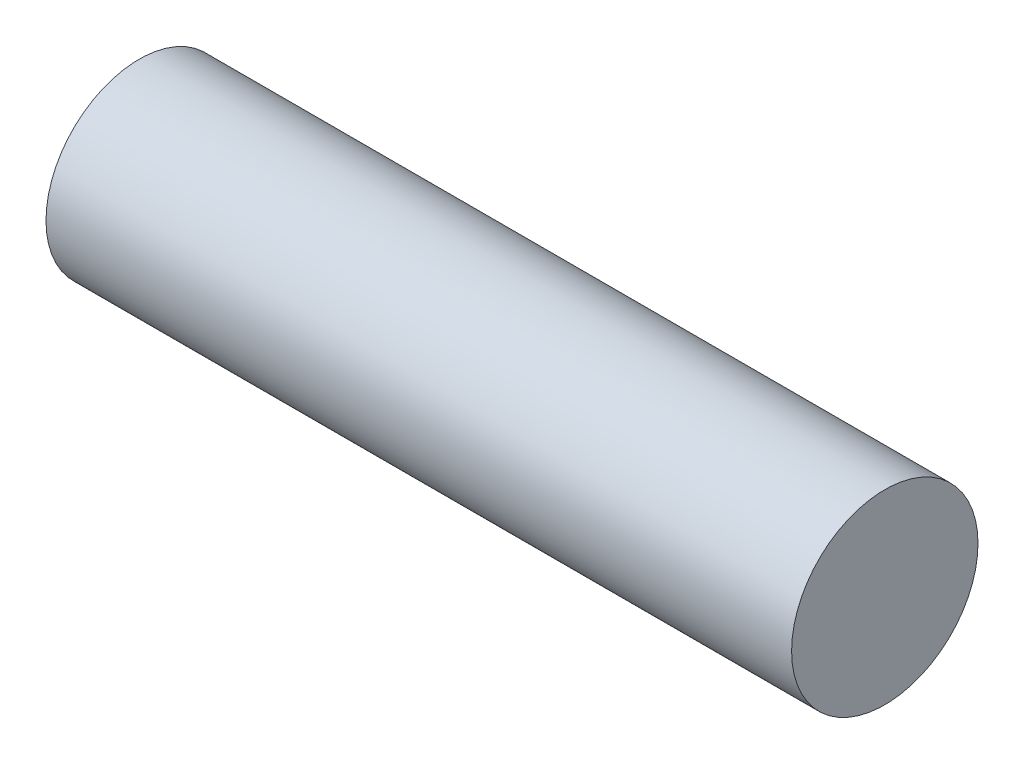
ISO-10303-21;
HEADER;
FILE_DESCRIPTION(('STEP AP214'),'2;1');
FILE_NAME('part.step','',(''),(''),'','','');
FILE_SCHEMA(('AUTOMOTIVE_DESIGN { 1 0 10303 214 1 1 1 1 }'));
ENDSEC;
DATA;
#1=APPLICATION_CONTEXT('core data for automotive mechanical design processes');
#2=APPLICATION_PROTOCOL_DEFINITION('international standard','automotive_design',2000,#1);
#3=PRODUCT_CONTEXT('',#1,'mechanical');
#4=PRODUCT('Part','Part','',(#3));
#5=PRODUCT_RELATED_PRODUCT_CATEGORY('part','',(#4));
#6=PRODUCT_DEFINITION_FORMATION('','',#4);
#7=PRODUCT_DEFINITION_CONTEXT('part definition',#1,'design');
#8=PRODUCT_DEFINITION('design','',#6,#7);
#9=PRODUCT_DEFINITION_SHAPE('','',#8);
#10=(LENGTH_UNIT() NAMED_UNIT(*) SI_UNIT(.MILLI.,.METRE.));
#11=(NAMED_UNIT(*) PLANE_ANGLE_UNIT() SI_UNIT($,.RADIAN.));
#12=(NAMED_UNIT(*) SI_UNIT($,.STERADIAN.) SOLID_ANGLE_UNIT());
#13=UNCERTAINTY_MEASURE_WITH_UNIT(LENGTH_MEASURE(1.E-05),#10,'distance_accuracy_value','');
#14=(GEOMETRIC_REPRESENTATION_CONTEXT(3) GLOBAL_UNCERTAINTY_ASSIGNED_CONTEXT((#13)) GLOBAL_UNIT_ASSIGNED_CONTEXT((#10,
#11,#12)) REPRESENTATION_CONTEXT('',''));
#15=CARTESIAN_POINT('',(0.,0.,0.));
#16=DIRECTION('',(0.,0.,1.));
#17=DIRECTION('',(1.,0.,0.));
#18=AXIS2_PLACEMENT_3D('',#15,#16,#17);
#19=CARTESIAN_POINT('',(-80.,0.,0.));
#20=DIRECTION('',(1.,0.,0.));
#21=DIRECTION('',(0.,0.,-1.));
#22=AXIS2_PLACEMENT_3D('',#19,#20,#21);
#23=CYLINDRICAL_SURFACE('',#22,10.);
#24=CARTESIAN_POINT('',(-80.,0.,0.));
#25=DIRECTION('',(1.,0.,0.));
#26=DIRECTION('',(0.,0.,-1.));
#27=AXIS2_PLACEMENT_3D('',#24,#25,#26);
#28=CIRCLE('',#27,10.);
#29=CARTESIAN_POINT('',(-80.,0.,-10.));
#30=VERTEX_POINT('',#29);
#31=EDGE_CURVE('E10',#30,#30,#28,.T.);
#32=ORIENTED_EDGE('',*,*,#31,.T.);
#33=EDGE_LOOP('',(#32));
#34=FACE_BOUND('',#33,.T.);
#35=CARTESIAN_POINT('',(0.,0.,0.));
#36=DIRECTION('',(1.,0.,0.));
#37=DIRECTION('',(0.,0.,-1.));
#38=AXIS2_PLACEMENT_3D('',#35,#36,#37);
#39=CIRCLE('',#38,10.);
#40=CARTESIAN_POINT('',(0.,0.,-10.));
#41=VERTEX_POINT('',#40);
#42=EDGE_CURVE('E40',#41,#41,#39,.T.);
#43=ORIENTED_EDGE('',*,*,#42,.F.);
#44=EDGE_LOOP('',(#43));
#45=FACE_BOUND('',#44,.T.);
#46=ADVANCED_FACE('F37',(#34,#45),#23,.T.);
#47=CARTESIAN_POINT('',(-80.,0.,0.));
#48=DIRECTION('',(1.,0.,0.));
#49=DIRECTION('',(0.,0.,-1.));
#50=AXIS2_PLACEMENT_3D('',#47,#48,#49);
#51=PLANE('',#50);
#52=ORIENTED_EDGE('',*,*,#31,.F.);
#53=EDGE_LOOP('',(#52));
#54=FACE_BOUND('',#53,.T.);
#55=ADVANCED_FACE('F54',(#54),#51,.F.);
#56=CARTESIAN_POINT('',(0.,0.,0.));
#57=DIRECTION('',(1.,0.,0.));
#58=DIRECTION('',(0.,0.,-1.));
#59=AXIS2_PLACEMENT_3D('',#56,#57,#58);
#60=PLANE('',#59);
#61=ORIENTED_EDGE('',*,*,#42,.T.);
#62=EDGE_LOOP('',(#61));
#63=FACE_BOUND('',#62,.T.);
#64=ADVANCED_FACE('F51',(#63),#60,.T.);
#65=CLOSED_SHELL('',(#46,#55,#64));
#66=MANIFOLD_SOLID_BREP('B2',#65);
#67=ADVANCED_BREP_SHAPE_REPRESENTATION('',(#18,#66),#14);
#68=SHAPE_DEFINITION_REPRESENTATION(#9,#67);
ENDSEC;
END-ISO-10303-21;
